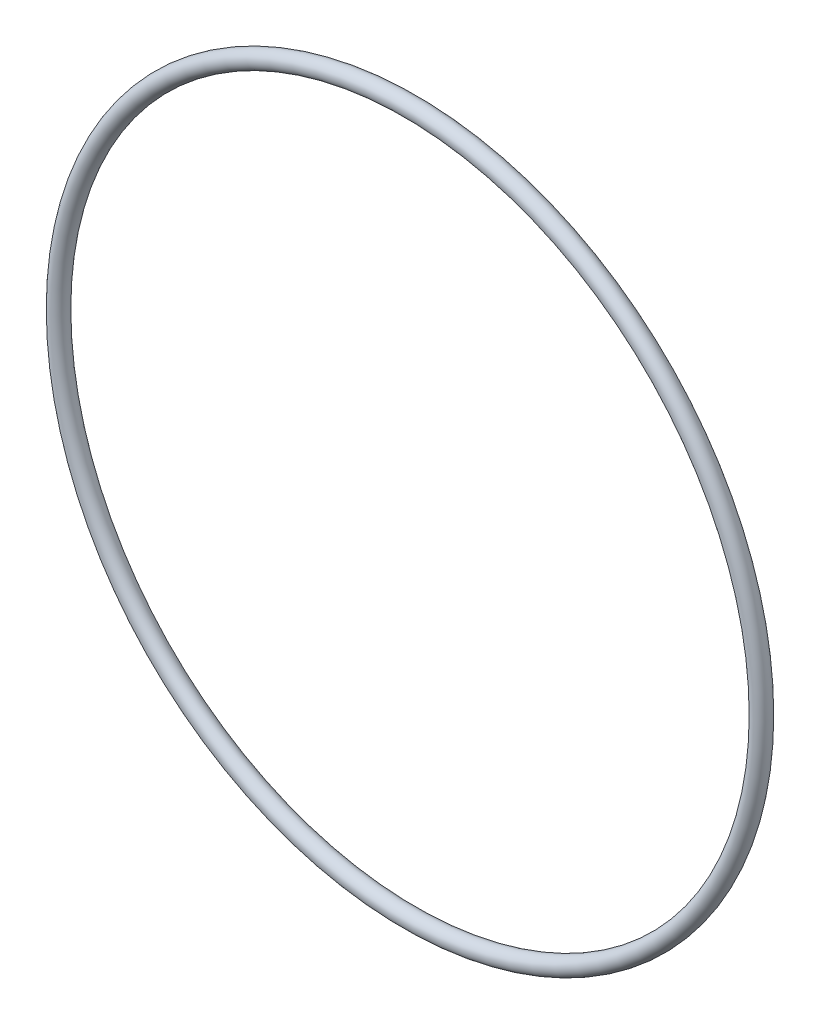
ISO-10303-21;
HEADER;
FILE_DESCRIPTION(('STEP AP214'),'2;1');
FILE_NAME('part.step','',(''),(''),'','','');
FILE_SCHEMA(('AUTOMOTIVE_DESIGN { 1 0 10303 214 1 1 1 1 }'));
ENDSEC;
DATA;
#1=APPLICATION_CONTEXT('core data for automotive mechanical design processes');
#2=APPLICATION_PROTOCOL_DEFINITION('international standard','automotive_design',2000,#1);
#3=PRODUCT_CONTEXT('',#1,'mechanical');
#4=PRODUCT('Part','Part','',(#3));
#5=PRODUCT_RELATED_PRODUCT_CATEGORY('part','',(#4));
#6=PRODUCT_DEFINITION_FORMATION('','',#4);
#7=PRODUCT_DEFINITION_CONTEXT('part definition',#1,'design');
#8=PRODUCT_DEFINITION('design','',#6,#7);
#9=PRODUCT_DEFINITION_SHAPE('','',#8);
#10=(LENGTH_UNIT() NAMED_UNIT(*) SI_UNIT(.MILLI.,.METRE.));
#11=(NAMED_UNIT(*) PLANE_ANGLE_UNIT() SI_UNIT($,.RADIAN.));
#12=(NAMED_UNIT(*) SI_UNIT($,.STERADIAN.) SOLID_ANGLE_UNIT());
#13=UNCERTAINTY_MEASURE_WITH_UNIT(LENGTH_MEASURE(1.E-05),#10,'distance_accuracy_value','');
#14=(GEOMETRIC_REPRESENTATION_CONTEXT(3) GLOBAL_UNCERTAINTY_ASSIGNED_CONTEXT((#13)) GLOBAL_UNIT_ASSIGNED_CONTEXT((#10,
#11,#12)) REPRESENTATION_CONTEXT('',''));
#15=CARTESIAN_POINT('',(0.,0.,0.));
#16=DIRECTION('',(0.,0.,1.));
#17=DIRECTION('',(1.,0.,0.));
#18=AXIS2_PLACEMENT_3D('',#15,#16,#17);
#19=CARTESIAN_POINT('',(0.,0.,0.));
#20=DIRECTION('',(0.,0.,1.));
#21=DIRECTION('',(1.,0.,0.));
#22=AXIS2_PLACEMENT_3D('',#19,#20,#21);
#23=TOROIDAL_SURFACE('',#22,71.4121,1.76529999999999);
#24=CARTESIAN_POINT('',(73.1774,0.,0.));
#25=VERTEX_POINT('',#24);
#26=VERTEX_LOOP('',#25);
#27=FACE_BOUND('',#26,.T.);
#28=ADVANCED_FACE('F35',(#27),#23,.T.);
#29=CLOSED_SHELL('',(#28));
#30=MANIFOLD_SOLID_BREP('B2',#29);
#31=ADVANCED_BREP_SHAPE_REPRESENTATION('',(#18,#30),#14);
#32=SHAPE_DEFINITION_REPRESENTATION(#9,#31);
ENDSEC;
END-ISO-10303-21;
